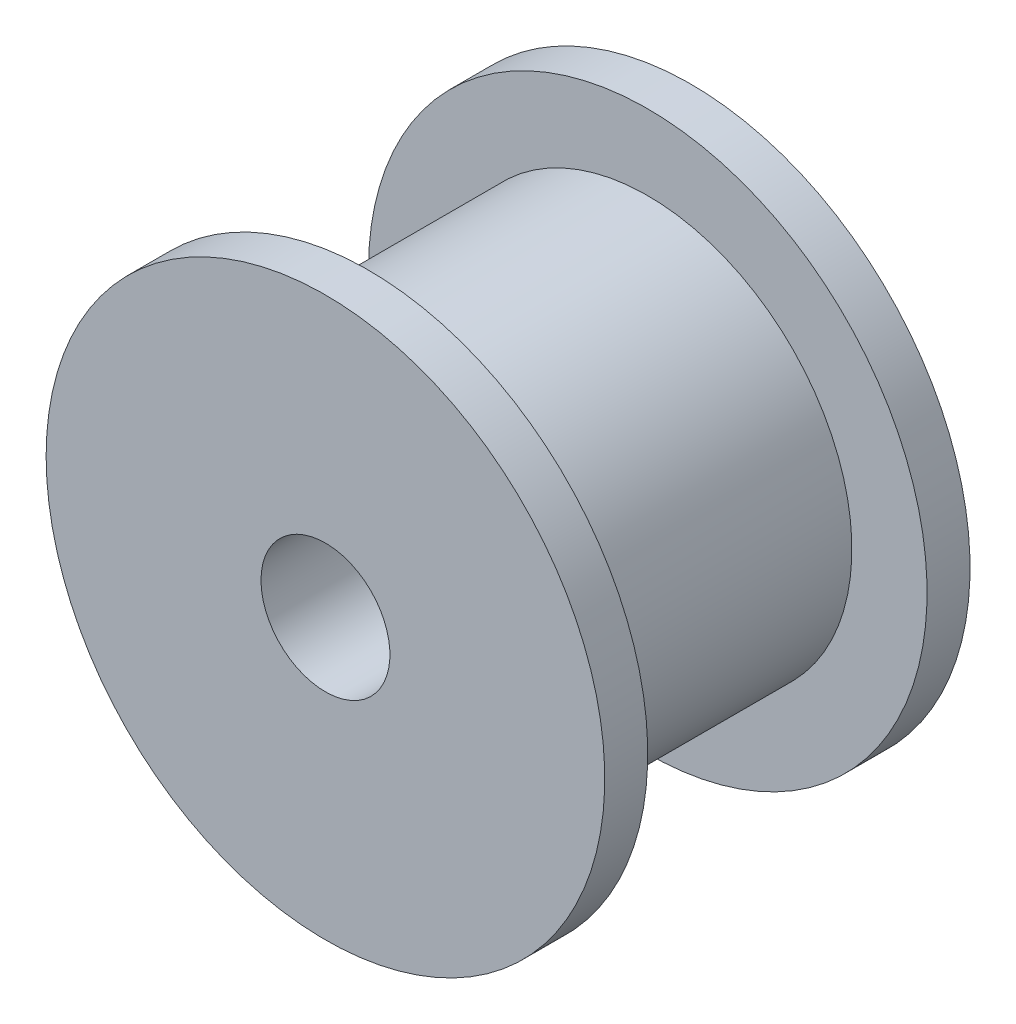
ISO-10303-21;
HEADER;
FILE_DESCRIPTION(('STEP AP214'),'2;1');
FILE_NAME('part.step','',(''),(''),'','','');
FILE_SCHEMA(('AUTOMOTIVE_DESIGN { 1 0 10303 214 1 1 1 1 }'));
ENDSEC;
DATA;
#1=APPLICATION_CONTEXT('core data for automotive mechanical design processes');
#2=APPLICATION_PROTOCOL_DEFINITION('international standard','automotive_design',2000,#1);
#3=PRODUCT_CONTEXT('',#1,'mechanical');
#4=PRODUCT('Part','Part','',(#3));
#5=PRODUCT_RELATED_PRODUCT_CATEGORY('part','',(#4));
#6=PRODUCT_DEFINITION_FORMATION('','',#4);
#7=PRODUCT_DEFINITION_CONTEXT('part definition',#1,'design');
#8=PRODUCT_DEFINITION('design','',#6,#7);
#9=PRODUCT_DEFINITION_SHAPE('','',#8);
#10=(LENGTH_UNIT() NAMED_UNIT(*) SI_UNIT(.MILLI.,.METRE.));
#11=(NAMED_UNIT(*) PLANE_ANGLE_UNIT() SI_UNIT($,.RADIAN.));
#12=(NAMED_UNIT(*) SI_UNIT($,.STERADIAN.) SOLID_ANGLE_UNIT());
#13=UNCERTAINTY_MEASURE_WITH_UNIT(LENGTH_MEASURE(1.E-05),#10,'distance_accuracy_value','');
#14=(GEOMETRIC_REPRESENTATION_CONTEXT(3) GLOBAL_UNCERTAINTY_ASSIGNED_CONTEXT((#13)) GLOBAL_UNIT_ASSIGNED_CONTEXT((#10,
#11,#12)) REPRESENTATION_CONTEXT('',''));
#15=CARTESIAN_POINT('',(0.,0.,0.));
#16=DIRECTION('',(0.,0.,1.));
#17=DIRECTION('',(1.,0.,0.));
#18=AXIS2_PLACEMENT_3D('',#15,#16,#17);
#19=CARTESIAN_POINT('',(6.5,0.,-3.25));
#20=DIRECTION('',(0.,0.,-1.));
#21=DIRECTION('',(-1.,0.,0.));
#22=AXIS2_PLACEMENT_3D('',#19,#20,#21);
#23=PLANE('',#22);
#24=CARTESIAN_POINT('',(1.75,0.,-3.25));
#25=DIRECTION('',(0.,0.,-1.));
#26=DIRECTION('',(-1.,0.,0.));
#27=AXIS2_PLACEMENT_3D('',#24,#25,#26);
#28=CIRCLE('',#27,6.5);
#29=CARTESIAN_POINT('',(-4.75,0.,-3.25));
#30=VERTEX_POINT('',#29);
#31=EDGE_CURVE('E10',#30,#30,#28,.T.);
#32=ORIENTED_EDGE('',*,*,#31,.F.);
#33=EDGE_LOOP('',(#32));
#34=FACE_BOUND('',#33,.T.);
#35=CARTESIAN_POINT('',(1.75,0.,-3.25));
#36=DIRECTION('',(0.,0.,-1.));
#37=DIRECTION('',(-1.,0.,0.));
#38=AXIS2_PLACEMENT_3D('',#35,#36,#37);
#39=CIRCLE('',#38,4.75);
#40=CARTESIAN_POINT('',(-3.,0.,-3.25));
#41=VERTEX_POINT('',#40);
#42=EDGE_CURVE('E64',#41,#41,#39,.T.);
#43=ORIENTED_EDGE('',*,*,#42,.T.);
#44=EDGE_LOOP('',(#43));
#45=FACE_BOUND('',#44,.T.);
#46=ADVANCED_FACE('F40',(#34,#45),#23,.F.);
#47=CARTESIAN_POINT('',(1.75,0.,-3.25));
#48=DIRECTION('',(0.,0.,-1.));
#49=DIRECTION('',(-1.,0.,0.));
#50=AXIS2_PLACEMENT_3D('',#47,#48,#49);
#51=CYLINDRICAL_SURFACE('',#50,6.5);
#52=CARTESIAN_POINT('',(1.75,0.,-4.25));
#53=DIRECTION('',(0.,0.,-1.));
#54=DIRECTION('',(-1.,0.,0.));
#55=AXIS2_PLACEMENT_3D('',#52,#53,#54);
#56=CIRCLE('',#55,6.5);
#57=CARTESIAN_POINT('',(-4.75,0.,-4.25));
#58=VERTEX_POINT('',#57);
#59=EDGE_CURVE('E43',#58,#58,#56,.T.);
#60=ORIENTED_EDGE('',*,*,#59,.F.);
#61=EDGE_LOOP('',(#60));
#62=FACE_BOUND('',#61,.T.);
#63=ORIENTED_EDGE('',*,*,#31,.T.);
#64=EDGE_LOOP('',(#63));
#65=FACE_BOUND('',#64,.T.);
#66=ADVANCED_FACE('F105',(#62,#65),#51,.T.);
#67=CARTESIAN_POINT('',(8.25,0.,-4.25));
#68=DIRECTION('',(0.,0.,1.));
#69=DIRECTION('',(1.,0.,0.));
#70=AXIS2_PLACEMENT_3D('',#67,#68,#69);
#71=PLANE('',#70);
#72=CARTESIAN_POINT('',(1.75,0.,-4.25));
#73=DIRECTION('',(0.,0.,-1.));
#74=DIRECTION('',(-1.,0.,0.));
#75=AXIS2_PLACEMENT_3D('',#72,#73,#74);
#76=CIRCLE('',#75,1.5);
#77=CARTESIAN_POINT('',(0.249999999999998,0.,-4.25));
#78=VERTEX_POINT('',#77);
#79=EDGE_CURVE('E50',#78,#78,#76,.T.);
#80=ORIENTED_EDGE('',*,*,#79,.F.);
#81=EDGE_LOOP('',(#80));
#82=FACE_BOUND('',#81,.T.);
#83=ORIENTED_EDGE('',*,*,#59,.T.);
#84=EDGE_LOOP('',(#83));
#85=FACE_BOUND('',#84,.T.);
#86=ADVANCED_FACE('F100',(#82,#85),#71,.F.);
#87=CARTESIAN_POINT('',(1.75,0.,-3.25));
#88=DIRECTION('',(0.,0.,-1.));
#89=DIRECTION('',(-1.,0.,0.));
#90=AXIS2_PLACEMENT_3D('',#87,#88,#89);
#91=CYLINDRICAL_SURFACE('',#90,1.5);
#92=CARTESIAN_POINT('',(1.75,0.,4.25));
#93=DIRECTION('',(0.,0.,-1.));
#94=DIRECTION('',(-1.,0.,0.));
#95=AXIS2_PLACEMENT_3D('',#92,#93,#94);
#96=CIRCLE('',#95,1.5);
#97=CARTESIAN_POINT('',(0.249999999999998,0.,4.25));
#98=VERTEX_POINT('',#97);
#99=EDGE_CURVE('E51',#98,#98,#96,.T.);
#100=ORIENTED_EDGE('',*,*,#99,.F.);
#101=EDGE_LOOP('',(#100));
#102=FACE_BOUND('',#101,.T.);
#103=ORIENTED_EDGE('',*,*,#79,.T.);
#104=EDGE_LOOP('',(#103));
#105=FACE_BOUND('',#104,.T.);
#106=ADVANCED_FACE('F93',(#102,#105),#91,.F.);
#107=CARTESIAN_POINT('',(3.25,0.,4.25));
#108=DIRECTION('',(0.,0.,-1.));
#109=DIRECTION('',(-1.,0.,0.));
#110=AXIS2_PLACEMENT_3D('',#107,#108,#109);
#111=PLANE('',#110);
#112=CARTESIAN_POINT('',(1.75,0.,4.25));
#113=DIRECTION('',(0.,0.,-1.));
#114=DIRECTION('',(-1.,0.,0.));
#115=AXIS2_PLACEMENT_3D('',#112,#113,#114);
#116=CIRCLE('',#115,6.5);
#117=CARTESIAN_POINT('',(-4.75,0.,4.25));
#118=VERTEX_POINT('',#117);
#119=EDGE_CURVE('E57',#118,#118,#116,.T.);
#120=ORIENTED_EDGE('',*,*,#119,.F.);
#121=EDGE_LOOP('',(#120));
#122=FACE_BOUND('',#121,.T.);
#123=ORIENTED_EDGE('',*,*,#99,.T.);
#124=EDGE_LOOP('',(#123));
#125=FACE_BOUND('',#124,.T.);
#126=ADVANCED_FACE('F84',(#122,#125),#111,.F.);
#127=CARTESIAN_POINT('',(1.75,0.,-3.25));
#128=DIRECTION('',(0.,0.,-1.));
#129=DIRECTION('',(-1.,0.,0.));
#130=AXIS2_PLACEMENT_3D('',#127,#128,#129);
#131=CYLINDRICAL_SURFACE('',#130,6.5);
#132=CARTESIAN_POINT('',(1.75,0.,3.25));
#133=DIRECTION('',(0.,0.,-1.));
#134=DIRECTION('',(-1.,0.,0.));
#135=AXIS2_PLACEMENT_3D('',#132,#133,#134);
#136=CIRCLE('',#135,6.5);
#137=CARTESIAN_POINT('',(-4.75,0.,3.25));
#138=VERTEX_POINT('',#137);
#139=EDGE_CURVE('E56',#138,#138,#136,.T.);
#140=ORIENTED_EDGE('',*,*,#139,.F.);
#141=EDGE_LOOP('',(#140));
#142=FACE_BOUND('',#141,.T.);
#143=ORIENTED_EDGE('',*,*,#119,.T.);
#144=EDGE_LOOP('',(#143));
#145=FACE_BOUND('',#144,.T.);
#146=ADVANCED_FACE('F78',(#142,#145),#131,.T.);
#147=CARTESIAN_POINT('',(8.25,0.,3.25));
#148=DIRECTION('',(0.,0.,1.));
#149=DIRECTION('',(1.,0.,0.));
#150=AXIS2_PLACEMENT_3D('',#147,#148,#149);
#151=PLANE('',#150);
#152=CARTESIAN_POINT('',(1.75,0.,3.25));
#153=DIRECTION('',(0.,0.,-1.));
#154=DIRECTION('',(-1.,0.,0.));
#155=AXIS2_PLACEMENT_3D('',#152,#153,#154);
#156=CIRCLE('',#155,4.75);
#157=CARTESIAN_POINT('',(-3.,0.,3.25));
#158=VERTEX_POINT('',#157);
#159=EDGE_CURVE('E65',#158,#158,#156,.T.);
#160=ORIENTED_EDGE('',*,*,#159,.F.);
#161=EDGE_LOOP('',(#160));
#162=FACE_BOUND('',#161,.T.);
#163=ORIENTED_EDGE('',*,*,#139,.T.);
#164=EDGE_LOOP('',(#163));
#165=FACE_BOUND('',#164,.T.);
#166=ADVANCED_FACE('F71',(#162,#165),#151,.F.);
#167=CARTESIAN_POINT('',(1.75,0.,-3.25));
#168=DIRECTION('',(0.,0.,-1.));
#169=DIRECTION('',(-1.,0.,0.));
#170=AXIS2_PLACEMENT_3D('',#167,#168,#169);
#171=CYLINDRICAL_SURFACE('',#170,4.75);
#172=ORIENTED_EDGE('',*,*,#42,.F.);
#173=EDGE_LOOP('',(#172));
#174=FACE_BOUND('',#173,.T.);
#175=ORIENTED_EDGE('',*,*,#159,.T.);
#176=EDGE_LOOP('',(#175));
#177=FACE_BOUND('',#176,.T.);
#178=ADVANCED_FACE('F69',(#174,#177),#171,.T.);
#179=CLOSED_SHELL('',(#46,#66,#86,#106,#126,#146,#166,#178));
#180=MANIFOLD_SOLID_BREP('B2',#179);
#181=ADVANCED_BREP_SHAPE_REPRESENTATION('',(#18,#180),#14);
#182=SHAPE_DEFINITION_REPRESENTATION(#9,#181);
ENDSEC;
END-ISO-10303-21;
